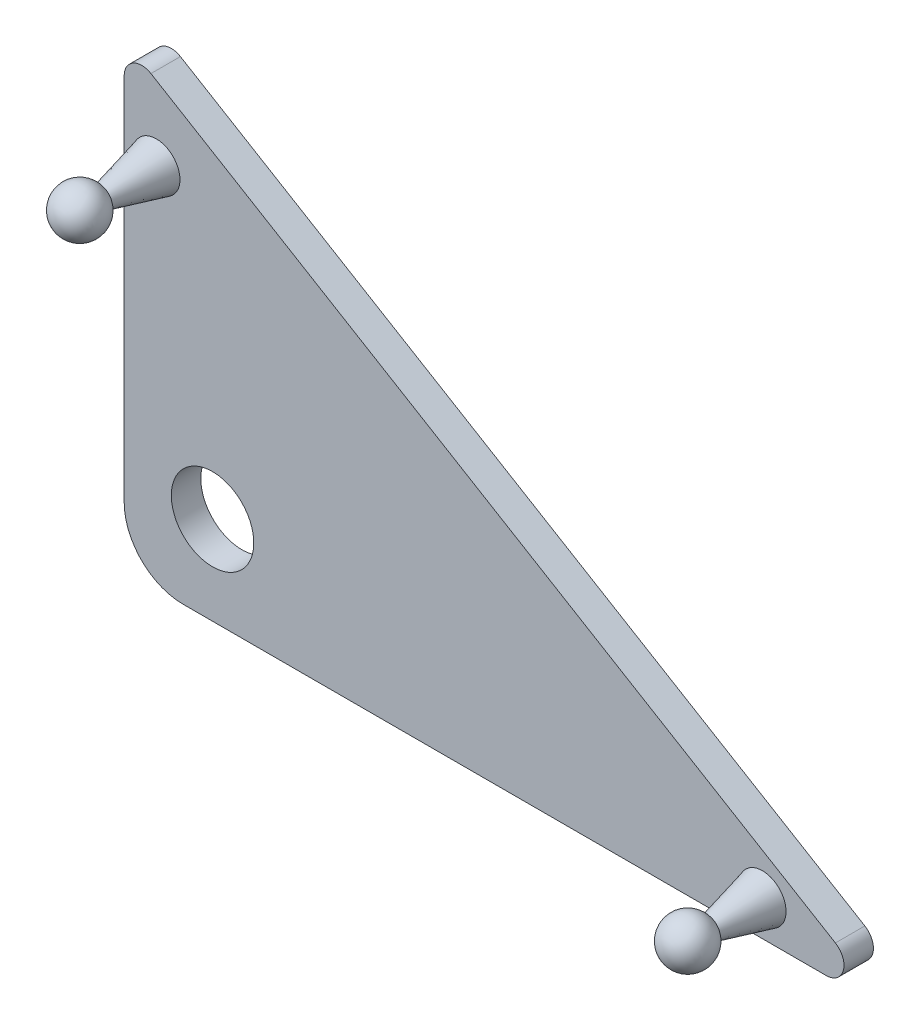
ISO-10303-21;
HEADER;
FILE_DESCRIPTION(('STEP AP214'),'2;1');
FILE_NAME('part.step','',(''),(''),'','','');
FILE_SCHEMA(('AUTOMOTIVE_DESIGN { 1 0 10303 214 1 1 1 1 }'));
ENDSEC;
DATA;
#1=APPLICATION_CONTEXT('core data for automotive mechanical design processes');
#2=APPLICATION_PROTOCOL_DEFINITION('international standard','automotive_design',2000,#1);
#3=PRODUCT_CONTEXT('',#1,'mechanical');
#4=PRODUCT('Part','Part','',(#3));
#5=PRODUCT_RELATED_PRODUCT_CATEGORY('part','',(#4));
#6=PRODUCT_DEFINITION_FORMATION('','',#4);
#7=PRODUCT_DEFINITION_CONTEXT('part definition',#1,'design');
#8=PRODUCT_DEFINITION('design','',#6,#7);
#9=PRODUCT_DEFINITION_SHAPE('','',#8);
#10=(LENGTH_UNIT() NAMED_UNIT(*) SI_UNIT(.MILLI.,.METRE.));
#11=(NAMED_UNIT(*) PLANE_ANGLE_UNIT() SI_UNIT($,.RADIAN.));
#12=(NAMED_UNIT(*) SI_UNIT($,.STERADIAN.) SOLID_ANGLE_UNIT());
#13=UNCERTAINTY_MEASURE_WITH_UNIT(LENGTH_MEASURE(1.E-05),#10,'distance_accuracy_value','');
#14=(GEOMETRIC_REPRESENTATION_CONTEXT(3) GLOBAL_UNCERTAINTY_ASSIGNED_CONTEXT((#13)) GLOBAL_UNIT_ASSIGNED_CONTEXT((#10,
#11,#12)) REPRESENTATION_CONTEXT('',''));
#15=CARTESIAN_POINT('',(0.,0.,0.));
#16=DIRECTION('',(0.,0.,1.));
#17=DIRECTION('',(1.,0.,0.));
#18=AXIS2_PLACEMENT_3D('',#15,#16,#17);
#19=CARTESIAN_POINT('',(108.338096210309,6.,5.));
#20=DIRECTION('',(0.,0.,-1.));
#21=DIRECTION('',(1.,0.,0.));
#22=AXIS2_PLACEMENT_3D('',#19,#20,#21);
#23=CONICAL_SURFACE('',#22,4.00000000000001,0.244346095279206);
#24=CARTESIAN_POINT('',(108.338096210309,6.,5.));
#25=DIRECTION('',(0.,0.,-1.));
#26=DIRECTION('',(-1.,0.,0.));
#27=AXIS2_PLACEMENT_3D('',#24,#25,#26);
#28=CIRCLE('',#27,4.00000000000001);
#29=CARTESIAN_POINT('',(104.338096210309,6.,5.));
#30=VERTEX_POINT('',#29);
#31=EDGE_CURVE('E40',#30,#30,#28,.F.);
#32=ORIENTED_EDGE('',*,*,#31,.T.);
#33=EDGE_LOOP('',(#32));
#34=FACE_BOUND('',#33,.T.);
#35=CARTESIAN_POINT('',(108.338096210309,6.,14.0894051426196));
#36=DIRECTION('',(0.,0.,1.));
#37=DIRECTION('',(1.,0.,0.));
#38=AXIS2_PLACEMENT_3D('',#35,#36,#37);
#39=CIRCLE('',#38,1.73375676875813);
#40=CARTESIAN_POINT('',(110.071852979068,6.,14.0894051426196));
#41=VERTEX_POINT('',#40);
#42=EDGE_CURVE('E11',#41,#41,#39,.T.);
#43=ORIENTED_EDGE('',*,*,#42,.F.);
#44=EDGE_LOOP('',(#43));
#45=FACE_BOUND('',#44,.T.);
#46=ADVANCED_FACE('F32',(#34,#45),#23,.T.);
#47=CARTESIAN_POINT('',(0.,0.,5.));
#48=DIRECTION('',(0.,0.,-1.));
#49=DIRECTION('',(-1.,0.,0.));
#50=AXIS2_PLACEMENT_3D('',#47,#48,#49);
#51=PLANE('',#50);
#52=CARTESIAN_POINT('',(5.46398521278585,62.1376068087983,5.));
#53=DIRECTION('',(0.,0.,-1.));
#54=DIRECTION('',(-1.,0.,0.));
#55=AXIS2_PLACEMENT_3D('',#52,#53,#54);
#56=CIRCLE('',#55,4.);
#57=CARTESIAN_POINT('',(1.46398521278585,62.1376068087983,5.));
#58=VERTEX_POINT('',#57);
#59=EDGE_CURVE('E124',#58,#58,#56,.F.);
#60=ORIENTED_EDGE('',*,*,#59,.F.);
#61=EDGE_LOOP('',(#60));
#62=FACE_BOUND('',#61,.T.);
#63=CARTESIAN_POINT('',(15.,15.,5.));
#64=DIRECTION('',(0.,0.,-1.));
#65=DIRECTION('',(-1.,0.,0.));
#66=AXIS2_PLACEMENT_3D('',#63,#64,#65);
#67=CIRCLE('',#66,7.);
#68=CARTESIAN_POINT('',(8.,15.,5.));
#69=VERTEX_POINT('',#68);
#70=EDGE_CURVE('E109',#69,#69,#67,.T.);
#71=ORIENTED_EDGE('',*,*,#70,.T.);
#72=EDGE_LOOP('',(#71));
#73=FACE_BOUND('',#72,.T.);
#74=DIRECTION('',(1.,0.,0.));
#75=VECTOR('',#74,1.);
#76=CARTESIAN_POINT('',(130.,0.,5.));
#77=LINE('',#76,#75);
#78=CARTESIAN_POINT('',(9.99999999999999,0.,5.));
#79=VERTEX_POINT('',#78);
#80=CARTESIAN_POINT('',(119.169048105155,0.,5.));
#81=VERTEX_POINT('',#80);
#82=EDGE_CURVE('E102',#79,#81,#77,.T.);
#83=ORIENTED_EDGE('',*,*,#82,.T.);
#84=CARTESIAN_POINT('',(119.169048105155,2.99999999999999,5.));
#85=DIRECTION('',(0.,0.,-1.));
#86=DIRECTION('',(-1.,0.,0.));
#87=AXIS2_PLACEMENT_3D('',#84,#85,#86);
#88=CIRCLE('',#87,3.);
#89=CARTESIAN_POINT('',(120.712535371437,5.57247877713761,5.));
#90=VERTEX_POINT('',#89);
#91=EDGE_CURVE('E140',#81,#90,#88,.F.);
#92=ORIENTED_EDGE('',*,*,#91,.T.);
#93=DIRECTION('',(-0.857492925712544,0.514495755427526,0.));
#94=VECTOR('',#93,1.);
#95=CARTESIAN_POINT('',(0.,78.,5.));
#96=LINE('',#95,#94);
#97=CARTESIAN_POINT('',(4.54348726628258,75.2739076402304,5.));
#98=VERTEX_POINT('',#97);
#99=EDGE_CURVE('E195',#90,#98,#96,.T.);
#100=ORIENTED_EDGE('',*,*,#99,.T.);
#101=CARTESIAN_POINT('',(3.,72.7014288630928,5.));
#102=DIRECTION('',(0.,0.,-1.));
#103=DIRECTION('',(-1.,0.,0.));
#104=AXIS2_PLACEMENT_3D('',#101,#102,#103);
#105=CIRCLE('',#104,3.);
#106=CARTESIAN_POINT('',(0.,72.7014288630928,5.));
#107=VERTEX_POINT('',#106);
#108=EDGE_CURVE('E47',#98,#107,#105,.F.);
#109=ORIENTED_EDGE('',*,*,#108,.T.);
#110=DIRECTION('',(0.,-1.,0.));
#111=VECTOR('',#110,1.);
#112=CARTESIAN_POINT('',(0.,0.,5.));
#113=LINE('',#112,#111);
#114=CARTESIAN_POINT('',(0.,10.,5.));
#115=VERTEX_POINT('',#114);
#116=EDGE_CURVE('E103',#107,#115,#113,.T.);
#117=ORIENTED_EDGE('',*,*,#116,.T.);
#118=CARTESIAN_POINT('',(9.99999999999999,10.,5.));
#119=DIRECTION('',(0.,0.,-1.));
#120=DIRECTION('',(-1.,0.,0.));
#121=AXIS2_PLACEMENT_3D('',#118,#119,#120);
#122=CIRCLE('',#121,10.);
#123=EDGE_CURVE('E122',#115,#79,#122,.F.);
#124=ORIENTED_EDGE('',*,*,#123,.T.);
#125=EDGE_LOOP('',(#83,#92,#100,#109,#117,#124));
#126=FACE_BOUND('',#125,.T.);
#127=ORIENTED_EDGE('',*,*,#31,.F.);
#128=EDGE_LOOP('',(#127));
#129=FACE_BOUND('',#128,.T.);
#130=ADVANCED_FACE('F149',(#62,#73,#126,#129),#51,.F.);
#131=CARTESIAN_POINT('',(5.46398521278585,62.1376068087983,5.));
#132=DIRECTION('',(0.,0.,-1.));
#133=DIRECTION('',(1.,0.,0.));
#134=AXIS2_PLACEMENT_3D('',#131,#132,#133);
#135=CONICAL_SURFACE('',#134,4.,0.244346095279206);
#136=ORIENTED_EDGE('',*,*,#59,.T.);
#137=EDGE_LOOP('',(#136));
#138=FACE_BOUND('',#137,.T.);
#139=CARTESIAN_POINT('',(5.46398521278585,62.1376068087983,14.3632219627393));
#140=DIRECTION('',(0.,0.,1.));
#141=DIRECTION('',(1.,0.,0.));
#142=AXIS2_PLACEMENT_3D('',#139,#140,#141);
#143=CIRCLE('',#142,1.66548656785281);
#144=CARTESIAN_POINT('',(7.12947178063866,62.1376068087983,14.3632219627393));
#145=VERTEX_POINT('',#144);
#146=EDGE_CURVE('E127',#145,#145,#143,.T.);
#147=ORIENTED_EDGE('',*,*,#146,.F.);
#148=EDGE_LOOP('',(#147));
#149=FACE_BOUND('',#148,.T.);
#150=ADVANCED_FACE('F151',(#138,#149),#135,.T.);
#151=CARTESIAN_POINT('',(130.,0.,5.));
#152=DIRECTION('',(0.,1.,0.));
#153=DIRECTION('',(-1.,0.,0.));
#154=AXIS2_PLACEMENT_3D('',#151,#152,#153);
#155=PLANE('',#154);
#156=DIRECTION('',(1.,0.,0.));
#157=VECTOR('',#156,1.);
#158=CARTESIAN_POINT('',(130.,0.,0.));
#159=LINE('',#158,#157);
#160=CARTESIAN_POINT('',(9.99999999999999,0.,0.));
#161=VERTEX_POINT('',#160);
#162=CARTESIAN_POINT('',(119.169048105155,0.,0.));
#163=VERTEX_POINT('',#162);
#164=EDGE_CURVE('E101',#161,#163,#159,.T.);
#165=ORIENTED_EDGE('',*,*,#164,.T.);
#166=DIRECTION('',(0.,0.,-1.));
#167=VECTOR('',#166,1.);
#168=CARTESIAN_POINT('',(119.169048105155,0.,5.));
#169=LINE('',#168,#167);
#170=EDGE_CURVE('E55',#163,#81,#169,.F.);
#171=ORIENTED_EDGE('',*,*,#170,.T.);
#172=ORIENTED_EDGE('',*,*,#82,.F.);
#173=DIRECTION('',(0.,0.,-1.));
#174=VECTOR('',#173,1.);
#175=CARTESIAN_POINT('',(9.99999999999999,0.,5.));
#176=LINE('',#175,#174);
#177=EDGE_CURVE('E93',#79,#161,#176,.T.);
#178=ORIENTED_EDGE('',*,*,#177,.T.);
#179=EDGE_LOOP('',(#165,#171,#172,#178));
#180=FACE_BOUND('',#179,.T.);
#181=ADVANCED_FACE('F100',(#180),#155,.F.);
#182=CARTESIAN_POINT('',(0.,78.,5.));
#183=DIRECTION('',(-0.514495755427526,-0.857492925712544,0.));
#184=DIRECTION('',(0.857492925712544,-0.514495755427526,0.));
#185=AXIS2_PLACEMENT_3D('',#182,#183,#184);
#186=PLANE('',#185);
#187=ORIENTED_EDGE('',*,*,#99,.F.);
#188=DIRECTION('',(0.,0.,-1.));
#189=VECTOR('',#188,1.);
#190=CARTESIAN_POINT('',(120.712535371437,5.57247877713762,5.));
#191=LINE('',#190,#189);
#192=CARTESIAN_POINT('',(120.712535371437,5.57247877713761,0.));
#193=VERTEX_POINT('',#192);
#194=EDGE_CURVE('E132',#90,#193,#191,.T.);
#195=ORIENTED_EDGE('',*,*,#194,.T.);
#196=DIRECTION('',(-0.857492925712544,0.514495755427526,0.));
#197=VECTOR('',#196,1.);
#198=CARTESIAN_POINT('',(0.,78.,0.));
#199=LINE('',#198,#197);
#200=CARTESIAN_POINT('',(4.54348726628258,75.2739076402304,0.));
#201=VERTEX_POINT('',#200);
#202=EDGE_CURVE('E108',#193,#201,#199,.T.);
#203=ORIENTED_EDGE('',*,*,#202,.T.);
#204=DIRECTION('',(0.,0.,-1.));
#205=VECTOR('',#204,1.);
#206=CARTESIAN_POINT('',(4.54348726628258,75.2739076402304,5.));
#207=LINE('',#206,#205);
#208=EDGE_CURVE('E130',#201,#98,#207,.F.);
#209=ORIENTED_EDGE('',*,*,#208,.T.);
#210=EDGE_LOOP('',(#187,#195,#203,#209));
#211=FACE_BOUND('',#210,.T.);
#212=ADVANCED_FACE('F172',(#211),#186,.F.);
#213=CARTESIAN_POINT('',(0.,0.,5.));
#214=DIRECTION('',(1.,0.,0.));
#215=DIRECTION('',(0.,0.,-1.));
#216=AXIS2_PLACEMENT_3D('',#213,#214,#215);
#217=PLANE('',#216);
#218=ORIENTED_EDGE('',*,*,#116,.F.);
#219=DIRECTION('',(0.,0.,-1.));
#220=VECTOR('',#219,1.);
#221=CARTESIAN_POINT('',(0.,72.7014288630928,5.));
#222=LINE('',#221,#220);
#223=CARTESIAN_POINT('',(0.,72.7014288630928,0.));
#224=VERTEX_POINT('',#223);
#225=EDGE_CURVE('E142',#107,#224,#222,.T.);
#226=ORIENTED_EDGE('',*,*,#225,.T.);
#227=DIRECTION('',(0.,-1.,0.));
#228=VECTOR('',#227,1.);
#229=CARTESIAN_POINT('',(0.,0.,0.));
#230=LINE('',#229,#228);
#231=CARTESIAN_POINT('',(0.,10.,0.));
#232=VERTEX_POINT('',#231);
#233=EDGE_CURVE('E112',#224,#232,#230,.T.);
#234=ORIENTED_EDGE('',*,*,#233,.T.);
#235=DIRECTION('',(0.,0.,-1.));
#236=VECTOR('',#235,1.);
#237=CARTESIAN_POINT('',(0.,10.,5.));
#238=LINE('',#237,#236);
#239=EDGE_CURVE('E95',#232,#115,#238,.F.);
#240=ORIENTED_EDGE('',*,*,#239,.T.);
#241=EDGE_LOOP('',(#218,#226,#234,#240));
#242=FACE_BOUND('',#241,.T.);
#243=ADVANCED_FACE('F168',(#242),#217,.F.);
#244=CARTESIAN_POINT('',(0.,0.,0.));
#245=DIRECTION('',(0.,0.,-1.));
#246=DIRECTION('',(-1.,0.,0.));
#247=AXIS2_PLACEMENT_3D('',#244,#245,#246);
#248=PLANE('',#247);
#249=CARTESIAN_POINT('',(15.,15.,0.));
#250=DIRECTION('',(0.,0.,-1.));
#251=DIRECTION('',(-1.,0.,0.));
#252=AXIS2_PLACEMENT_3D('',#249,#250,#251);
#253=CIRCLE('',#252,7.);
#254=CARTESIAN_POINT('',(8.,15.,0.));
#255=VERTEX_POINT('',#254);
#256=EDGE_CURVE('E115',#255,#255,#253,.T.);
#257=ORIENTED_EDGE('',*,*,#256,.F.);
#258=EDGE_LOOP('',(#257));
#259=FACE_BOUND('',#258,.T.);
#260=ORIENTED_EDGE('',*,*,#202,.F.);
#261=CARTESIAN_POINT('',(119.169048105155,2.99999999999999,0.));
#262=DIRECTION('',(0.,0.,-1.));
#263=DIRECTION('',(-1.,0.,0.));
#264=AXIS2_PLACEMENT_3D('',#261,#262,#263);
#265=CIRCLE('',#264,3.);
#266=EDGE_CURVE('E107',#193,#163,#265,.T.);
#267=ORIENTED_EDGE('',*,*,#266,.T.);
#268=ORIENTED_EDGE('',*,*,#164,.F.);
#269=CARTESIAN_POINT('',(9.99999999999999,10.,0.));
#270=DIRECTION('',(0.,0.,-1.));
#271=DIRECTION('',(-1.,0.,0.));
#272=AXIS2_PLACEMENT_3D('',#269,#270,#271);
#273=CIRCLE('',#272,10.);
#274=EDGE_CURVE('E89',#161,#232,#273,.T.);
#275=ORIENTED_EDGE('',*,*,#274,.T.);
#276=ORIENTED_EDGE('',*,*,#233,.F.);
#277=CARTESIAN_POINT('',(3.,72.7014288630928,0.));
#278=DIRECTION('',(0.,0.,-1.));
#279=DIRECTION('',(-1.,0.,0.));
#280=AXIS2_PLACEMENT_3D('',#277,#278,#279);
#281=CIRCLE('',#280,3.);
#282=EDGE_CURVE('E135',#224,#201,#281,.T.);
#283=ORIENTED_EDGE('',*,*,#282,.T.);
#284=EDGE_LOOP('',(#260,#267,#268,#275,#276,#283));
#285=FACE_BOUND('',#284,.T.);
#286=ADVANCED_FACE('F106',(#259,#285),#248,.T.);
#287=CARTESIAN_POINT('',(15.,15.,5.));
#288=DIRECTION('',(0.,0.,-1.));
#289=DIRECTION('',(-1.,0.,0.));
#290=AXIS2_PLACEMENT_3D('',#287,#288,#289);
#291=CYLINDRICAL_SURFACE('',#290,7.);
#292=ORIENTED_EDGE('',*,*,#70,.F.);
#293=EDGE_LOOP('',(#292));
#294=FACE_BOUND('',#293,.T.);
#295=ORIENTED_EDGE('',*,*,#256,.T.);
#296=EDGE_LOOP('',(#295));
#297=FACE_BOUND('',#296,.T.);
#298=ADVANCED_FACE('F165',(#294,#297),#291,.F.);
#299=CARTESIAN_POINT('',(9.99999999999999,10.,5.));
#300=DIRECTION('',(0.,0.,-1.));
#301=DIRECTION('',(-1.,0.,0.));
#302=AXIS2_PLACEMENT_3D('',#299,#300,#301);
#303=CYLINDRICAL_SURFACE('',#302,10.);
#304=ORIENTED_EDGE('',*,*,#123,.F.);
#305=ORIENTED_EDGE('',*,*,#239,.F.);
#306=ORIENTED_EDGE('',*,*,#274,.F.);
#307=ORIENTED_EDGE('',*,*,#177,.F.);
#308=EDGE_LOOP('',(#304,#305,#306,#307));
#309=FACE_BOUND('',#308,.T.);
#310=ADVANCED_FACE('F92',(#309),#303,.T.);
#311=CARTESIAN_POINT('',(5.46398521278585,62.1376068087983,18.));
#312=DIRECTION('',(1.,0.,0.));
#313=DIRECTION('',(0.,0.,1.));
#314=AXIS2_PLACEMENT_3D('',#311,#312,#313);
#315=SPHERICAL_SURFACE('',#314,4.);
#316=CARTESIAN_POINT('',(5.46398521278585,62.1376068087983,18.));
#317=DIRECTION('',(0.,0.,1.));
#318=DIRECTION('',(1.,0.,0.));
#319=AXIS2_PLACEMENT_3D('',#316,#317,#318);
#320=SPHERICAL_SURFACE('',#319,4.);
#321=ORIENTED_EDGE('',*,*,#146,.T.);
#322=EDGE_LOOP('',(#321));
#323=FACE_BOUND('',#322,.T.);
#324=ADVANCED_FACE('F180',(#323),#320,.T.);
#325=CARTESIAN_POINT('',(119.169048105155,2.99999999999999,5.));
#326=DIRECTION('',(0.,0.,-1.));
#327=DIRECTION('',(-1.,0.,0.));
#328=AXIS2_PLACEMENT_3D('',#325,#326,#327);
#329=CYLINDRICAL_SURFACE('',#328,3.);
#330=ORIENTED_EDGE('',*,*,#91,.F.);
#331=ORIENTED_EDGE('',*,*,#170,.F.);
#332=ORIENTED_EDGE('',*,*,#266,.F.);
#333=ORIENTED_EDGE('',*,*,#194,.F.);
#334=EDGE_LOOP('',(#330,#331,#332,#333));
#335=FACE_BOUND('',#334,.T.);
#336=ADVANCED_FACE('F181',(#335),#329,.T.);
#337=CARTESIAN_POINT('',(3.,72.7014288630928,5.));
#338=DIRECTION('',(0.,0.,-1.));
#339=DIRECTION('',(-1.,0.,0.));
#340=AXIS2_PLACEMENT_3D('',#337,#338,#339);
#341=CYLINDRICAL_SURFACE('',#340,3.);
#342=ORIENTED_EDGE('',*,*,#108,.F.);
#343=ORIENTED_EDGE('',*,*,#208,.F.);
#344=ORIENTED_EDGE('',*,*,#282,.F.);
#345=ORIENTED_EDGE('',*,*,#225,.F.);
#346=EDGE_LOOP('',(#342,#343,#344,#345));
#347=FACE_BOUND('',#346,.T.);
#348=ADVANCED_FACE('F34',(#347),#341,.T.);
#349=CARTESIAN_POINT('',(108.338096210309,6.,17.6941364040017));
#350=DIRECTION('',(1.,0.,0.));
#351=DIRECTION('',(0.,0.,1.));
#352=AXIS2_PLACEMENT_3D('',#349,#350,#351);
#353=SPHERICAL_SURFACE('',#352,4.);
#354=CARTESIAN_POINT('',(108.338096210309,6.,17.6941364040017));
#355=DIRECTION('',(0.,0.,1.));
#356=DIRECTION('',(1.,0.,0.));
#357=AXIS2_PLACEMENT_3D('',#354,#355,#356);
#358=SPHERICAL_SURFACE('',#357,4.);
#359=ORIENTED_EDGE('',*,*,#42,.T.);
#360=EDGE_LOOP('',(#359));
#361=FACE_BOUND('',#360,.T.);
#362=ADVANCED_FACE('F188',(#361),#358,.T.);
#363=CLOSED_SHELL('',(#46,#130,#150,#181,#212,#243,#286,#298,#310,#324,#336,#348,#362));
#364=MANIFOLD_SOLID_BREP('B2',#363);
#365=ADVANCED_BREP_SHAPE_REPRESENTATION('',(#18,#364),#14);
#366=SHAPE_DEFINITION_REPRESENTATION(#9,#365);
ENDSEC;
END-ISO-10303-21;
